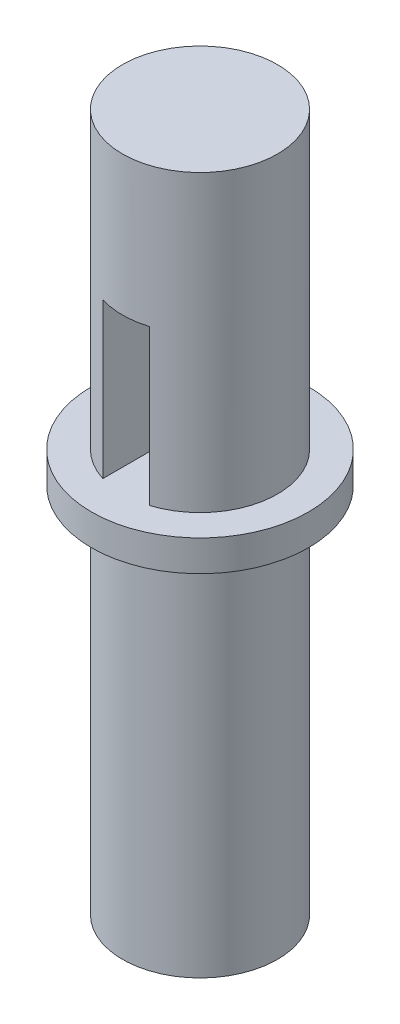
ISO-10303-21;
HEADER;
FILE_DESCRIPTION(('STEP AP214'),'2;1');
FILE_NAME('part.step','',(''),(''),'','','');
FILE_SCHEMA(('AUTOMOTIVE_DESIGN { 1 0 10303 214 1 1 1 1 }'));
ENDSEC;
DATA;
#1=APPLICATION_CONTEXT('core data for automotive mechanical design processes');
#2=APPLICATION_PROTOCOL_DEFINITION('international standard','automotive_design',2000,#1);
#3=PRODUCT_CONTEXT('',#1,'mechanical');
#4=PRODUCT('Part','Part','',(#3));
#5=PRODUCT_RELATED_PRODUCT_CATEGORY('part','',(#4));
#6=PRODUCT_DEFINITION_FORMATION('','',#4);
#7=PRODUCT_DEFINITION_CONTEXT('part definition',#1,'design');
#8=PRODUCT_DEFINITION('design','',#6,#7);
#9=PRODUCT_DEFINITION_SHAPE('','',#8);
#10=(LENGTH_UNIT() NAMED_UNIT(*) SI_UNIT(.MILLI.,.METRE.));
#11=(NAMED_UNIT(*) PLANE_ANGLE_UNIT() SI_UNIT($,.RADIAN.));
#12=(NAMED_UNIT(*) SI_UNIT($,.STERADIAN.) SOLID_ANGLE_UNIT());
#13=UNCERTAINTY_MEASURE_WITH_UNIT(LENGTH_MEASURE(1.E-05),#10,'distance_accuracy_value','');
#14=(GEOMETRIC_REPRESENTATION_CONTEXT(3) GLOBAL_UNCERTAINTY_ASSIGNED_CONTEXT((#13)) GLOBAL_UNIT_ASSIGNED_CONTEXT((#10,
#11,#12)) REPRESENTATION_CONTEXT('',''));
#15=CARTESIAN_POINT('',(0.,0.,0.));
#16=DIRECTION('',(0.,0.,1.));
#17=DIRECTION('',(1.,0.,0.));
#18=AXIS2_PLACEMENT_3D('',#15,#16,#17);
#19=CARTESIAN_POINT('',(1.60992891637893,60.,0.));
#20=DIRECTION('',(0.,-1.,0.));
#21=DIRECTION('',(0.,0.,-1.));
#22=AXIS2_PLACEMENT_3D('',#19,#20,#21);
#23=CYLINDRICAL_SURFACE('',#22,5.);
#24=CARTESIAN_POINT('',(1.60992891637893,39.,0.));
#25=DIRECTION('',(0.,-1.,0.));
#26=DIRECTION('',(0.,0.,-1.));
#27=AXIS2_PLACEMENT_3D('',#24,#25,#26);
#28=CIRCLE('',#27,5.);
#29=CARTESIAN_POINT('',(1.60992891637893,39.,-5.));
#30=VERTEX_POINT('',#29);
#31=EDGE_CURVE('E48',#30,#30,#28,.T.);
#32=ORIENTED_EDGE('',*,*,#31,.T.);
#33=EDGE_LOOP('',(#32));
#34=FACE_BOUND('',#33,.T.);
#35=CARTESIAN_POINT('',(1.60992891637893,15.,0.));
#36=DIRECTION('',(0.,-1.,0.));
#37=DIRECTION('',(0.,0.,-1.));
#38=AXIS2_PLACEMENT_3D('',#35,#36,#37);
#39=CIRCLE('',#38,5.);
#40=CARTESIAN_POINT('',(1.60992891637893,15.,-5.));
#41=VERTEX_POINT('',#40);
#42=EDGE_CURVE('E117',#41,#41,#39,.T.);
#43=ORIENTED_EDGE('',*,*,#42,.F.);
#44=EDGE_LOOP('',(#43));
#45=FACE_BOUND('',#44,.T.);
#46=ADVANCED_FACE('F45',(#34,#45),#23,.T.);
#47=CARTESIAN_POINT('',(1.60992891637893,15.,0.));
#48=DIRECTION('',(0.,-1.,0.));
#49=DIRECTION('',(0.,0.,-1.));
#50=AXIS2_PLACEMENT_3D('',#47,#48,#49);
#51=PLANE('',#50);
#52=ORIENTED_EDGE('',*,*,#42,.T.);
#53=EDGE_LOOP('',(#52));
#54=FACE_BOUND('',#53,.T.);
#55=ADVANCED_FACE('F162',(#54),#51,.T.);
#56=CARTESIAN_POINT('',(1.60992891637893,39.,0.));
#57=DIRECTION('',(0.,1.,0.));
#58=DIRECTION('',(0.,0.,1.));
#59=AXIS2_PLACEMENT_3D('',#56,#57,#58);
#60=CYLINDRICAL_SURFACE('',#59,7.);
#61=CARTESIAN_POINT('',(1.60992891637893,39.,0.));
#62=DIRECTION('',(0.,-1.,0.));
#63=DIRECTION('',(0.,0.,-1.));
#64=AXIS2_PLACEMENT_3D('',#61,#62,#63);
#65=CIRCLE('',#64,7.);
#66=CARTESIAN_POINT('',(1.60992891637893,39.,-7.));
#67=VERTEX_POINT('',#66);
#68=EDGE_CURVE('E118',#67,#67,#65,.T.);
#69=ORIENTED_EDGE('',*,*,#68,.F.);
#70=EDGE_LOOP('',(#69));
#71=FACE_BOUND('',#70,.T.);
#72=CARTESIAN_POINT('',(1.60992891637893,41.,0.));
#73=DIRECTION('',(0.,-1.,0.));
#74=DIRECTION('',(0.,0.,-1.));
#75=AXIS2_PLACEMENT_3D('',#72,#73,#74);
#76=CIRCLE('',#75,7.);
#77=CARTESIAN_POINT('',(1.60992891637893,41.,-7.));
#78=VERTEX_POINT('',#77);
#79=EDGE_CURVE('E121',#78,#78,#76,.T.);
#80=ORIENTED_EDGE('',*,*,#79,.T.);
#81=EDGE_LOOP('',(#80));
#82=FACE_BOUND('',#81,.T.);
#83=ADVANCED_FACE('F156',(#71,#82),#60,.T.);
#84=CARTESIAN_POINT('',(1.60992891637893,39.,0.));
#85=DIRECTION('',(0.,-1.,0.));
#86=DIRECTION('',(0.,0.,-1.));
#87=AXIS2_PLACEMENT_3D('',#84,#85,#86);
#88=PLANE('',#87);
#89=ORIENTED_EDGE('',*,*,#31,.F.);
#90=EDGE_LOOP('',(#89));
#91=FACE_BOUND('',#90,.T.);
#92=ORIENTED_EDGE('',*,*,#68,.T.);
#93=EDGE_LOOP('',(#92));
#94=FACE_BOUND('',#93,.T.);
#95=ADVANCED_FACE('F148',(#91,#94),#88,.T.);
#96=CARTESIAN_POINT('',(0.109928916378928,51.,-30.));
#97=DIRECTION('',(0.,-1.,0.));
#98=DIRECTION('',(0.,0.,-1.));
#99=AXIS2_PLACEMENT_3D('',#96,#97,#98);
#100=PLANE('',#99);
#101=CARTESIAN_POINT('',(1.60992891637893,51.,0.));
#102=DIRECTION('',(0.,-1.,0.));
#103=DIRECTION('',(0.,0.,-1.));
#104=AXIS2_PLACEMENT_3D('',#101,#102,#103);
#105=CIRCLE('',#104,5.);
#106=CARTESIAN_POINT('',(3.10992891637893,51.,4.76969600708473));
#107=VERTEX_POINT('',#106);
#108=CARTESIAN_POINT('',(0.109928916378928,51.,4.76969600708473));
#109=VERTEX_POINT('',#108);
#110=EDGE_CURVE('E54',#107,#109,#105,.T.);
#111=ORIENTED_EDGE('',*,*,#110,.T.);
#112=DIRECTION('',(0.,0.,1.));
#113=VECTOR('',#112,1.);
#114=CARTESIAN_POINT('',(0.109928916378928,51.,-30.));
#115=LINE('',#114,#113);
#116=CARTESIAN_POINT('',(0.109928916378928,51.,-4.76969600708473));
#117=VERTEX_POINT('',#116);
#118=EDGE_CURVE('E130',#117,#109,#115,.T.);
#119=ORIENTED_EDGE('',*,*,#118,.F.);
#120=CARTESIAN_POINT('',(3.10992891637893,51.,-4.76969600708473));
#121=VERTEX_POINT('',#120);
#122=EDGE_CURVE('E99',#117,#121,#105,.T.);
#123=ORIENTED_EDGE('',*,*,#122,.T.);
#124=DIRECTION('',(0.,0.,1.));
#125=VECTOR('',#124,1.);
#126=CARTESIAN_POINT('',(3.10992891637893,51.,-30.));
#127=LINE('',#126,#125);
#128=EDGE_CURVE('E95',#121,#107,#127,.T.);
#129=ORIENTED_EDGE('',*,*,#128,.T.);
#130=EDGE_LOOP('',(#111,#119,#123,#129));
#131=FACE_BOUND('',#130,.T.);
#132=ADVANCED_FACE('F145',(#131),#100,.T.);
#133=CARTESIAN_POINT('',(1.60992891637893,60.,0.));
#134=DIRECTION('',(0.,1.,0.));
#135=DIRECTION('',(0.,0.,1.));
#136=AXIS2_PLACEMENT_3D('',#133,#134,#135);
#137=PLANE('',#136);
#138=CARTESIAN_POINT('',(1.60992891637893,60.,0.));
#139=DIRECTION('',(0.,1.,0.));
#140=DIRECTION('',(0.,0.,1.));
#141=AXIS2_PLACEMENT_3D('',#138,#139,#140);
#142=CIRCLE('',#141,5.);
#143=CARTESIAN_POINT('',(1.60992891637893,60.,5.));
#144=VERTEX_POINT('',#143);
#145=EDGE_CURVE('E100',#144,#144,#142,.T.);
#146=ORIENTED_EDGE('',*,*,#145,.T.);
#147=EDGE_LOOP('',(#146));
#148=FACE_BOUND('',#147,.T.);
#149=ADVANCED_FACE('F147',(#148),#137,.T.);
#150=CARTESIAN_POINT('',(0.109928916378928,41.,-30.));
#151=DIRECTION('',(1.,0.,0.));
#152=DIRECTION('',(0.,0.,-1.));
#153=AXIS2_PLACEMENT_3D('',#150,#151,#152);
#154=PLANE('',#153);
#155=DIRECTION('',(0.,-1.,0.));
#156=VECTOR('',#155,1.);
#157=CARTESIAN_POINT('',(0.109928916378928,60.,4.76969600708473));
#158=LINE('',#157,#156);
#159=CARTESIAN_POINT('',(0.109928916378928,41.,4.76969600708473));
#160=VERTEX_POINT('',#159);
#161=EDGE_CURVE('E11',#109,#160,#158,.T.);
#162=ORIENTED_EDGE('',*,*,#161,.T.);
#163=DIRECTION('',(0.,0.,1.));
#164=VECTOR('',#163,1.);
#165=CARTESIAN_POINT('',(0.109928916378928,41.,-30.));
#166=LINE('',#165,#164);
#167=CARTESIAN_POINT('',(0.109928916378928,41.,-4.76969600708473));
#168=VERTEX_POINT('',#167);
#169=EDGE_CURVE('E108',#168,#160,#166,.T.);
#170=ORIENTED_EDGE('',*,*,#169,.F.);
#171=DIRECTION('',(0.,-1.,0.));
#172=VECTOR('',#171,1.);
#173=CARTESIAN_POINT('',(0.109928916378928,60.,-4.76969600708473));
#174=LINE('',#173,#172);
#175=EDGE_CURVE('E138',#168,#117,#174,.F.);
#176=ORIENTED_EDGE('',*,*,#175,.T.);
#177=ORIENTED_EDGE('',*,*,#118,.T.);
#178=EDGE_LOOP('',(#162,#170,#176,#177));
#179=FACE_BOUND('',#178,.T.);
#180=ADVANCED_FACE('F144',(#179),#154,.T.);
#181=ORIENTED_EDGE('',*,*,#145,.F.);
#182=EDGE_LOOP('',(#181));
#183=FACE_BOUND('',#182,.T.);
#184=CARTESIAN_POINT('',(1.60992891637893,41.,0.));
#185=DIRECTION('',(0.,-1.,0.));
#186=DIRECTION('',(0.,0.,-1.));
#187=AXIS2_PLACEMENT_3D('',#184,#185,#186);
#188=CIRCLE('',#187,5.);
#189=CARTESIAN_POINT('',(3.10992891637893,41.,-4.76969600708473));
#190=VERTEX_POINT('',#189);
#191=CARTESIAN_POINT('',(3.10992891637893,41.,4.76969600708473));
#192=VERTEX_POINT('',#191);
#193=EDGE_CURVE('E106',#190,#192,#188,.T.);
#194=ORIENTED_EDGE('',*,*,#193,.F.);
#195=DIRECTION('',(0.,-1.,0.));
#196=VECTOR('',#195,1.);
#197=CARTESIAN_POINT('',(3.10992891637893,60.,-4.76969600708473));
#198=LINE('',#197,#196);
#199=EDGE_CURVE('E90',#190,#121,#198,.F.);
#200=ORIENTED_EDGE('',*,*,#199,.T.);
#201=ORIENTED_EDGE('',*,*,#122,.F.);
#202=ORIENTED_EDGE('',*,*,#175,.F.);
#203=EDGE_CURVE('E61',#160,#168,#188,.T.);
#204=ORIENTED_EDGE('',*,*,#203,.F.);
#205=ORIENTED_EDGE('',*,*,#161,.F.);
#206=ORIENTED_EDGE('',*,*,#110,.F.);
#207=DIRECTION('',(0.,-1.,0.));
#208=VECTOR('',#207,1.);
#209=CARTESIAN_POINT('',(3.10992891637893,60.,4.76969600708473));
#210=LINE('',#209,#208);
#211=EDGE_CURVE('E111',#107,#192,#210,.T.);
#212=ORIENTED_EDGE('',*,*,#211,.T.);
#213=EDGE_LOOP('',(#194,#200,#201,#202,#204,#205,#206,#212));
#214=FACE_BOUND('',#213,.T.);
#215=ADVANCED_FACE('F110',(#183,#214),#23,.T.);
#216=CARTESIAN_POINT('',(3.10992891637893,41.,-30.));
#217=DIRECTION('',(1.,0.,0.));
#218=DIRECTION('',(0.,0.,-1.));
#219=AXIS2_PLACEMENT_3D('',#216,#217,#218);
#220=PLANE('',#219);
#221=ORIENTED_EDGE('',*,*,#128,.F.);
#222=ORIENTED_EDGE('',*,*,#199,.F.);
#223=DIRECTION('',(0.,0.,1.));
#224=VECTOR('',#223,1.);
#225=CARTESIAN_POINT('',(3.10992891637893,41.,-30.));
#226=LINE('',#225,#224);
#227=EDGE_CURVE('E93',#190,#192,#226,.T.);
#228=ORIENTED_EDGE('',*,*,#227,.T.);
#229=ORIENTED_EDGE('',*,*,#211,.F.);
#230=EDGE_LOOP('',(#221,#222,#228,#229));
#231=FACE_BOUND('',#230,.T.);
#232=ADVANCED_FACE('F92',(#231),#220,.F.);
#233=CARTESIAN_POINT('',(0.109928916378928,41.,-30.));
#234=DIRECTION('',(0.,-1.,0.));
#235=DIRECTION('',(0.,0.,-1.));
#236=AXIS2_PLACEMENT_3D('',#233,#234,#235);
#237=PLANE('',#236);
#238=ORIENTED_EDGE('',*,*,#169,.T.);
#239=ORIENTED_EDGE('',*,*,#203,.T.);
#240=EDGE_LOOP('',(#238,#239));
#241=FACE_BOUND('',#240,.T.);
#242=ORIENTED_EDGE('',*,*,#227,.F.);
#243=ORIENTED_EDGE('',*,*,#193,.T.);
#244=EDGE_LOOP('',(#242,#243));
#245=FACE_BOUND('',#244,.T.);
#246=ORIENTED_EDGE('',*,*,#79,.F.);
#247=EDGE_LOOP('',(#246));
#248=FACE_BOUND('',#247,.T.);
#249=ADVANCED_FACE('F104',(#241,#245,#248),#237,.F.);
#250=CLOSED_SHELL('',(#46,#55,#83,#95,#132,#149,#180,#215,#232,#249));
#251=MANIFOLD_SOLID_BREP('B2',#250);
#252=ADVANCED_BREP_SHAPE_REPRESENTATION('',(#18,#251),#14);
#253=SHAPE_DEFINITION_REPRESENTATION(#9,#252);
ENDSEC;
END-ISO-10303-21;
